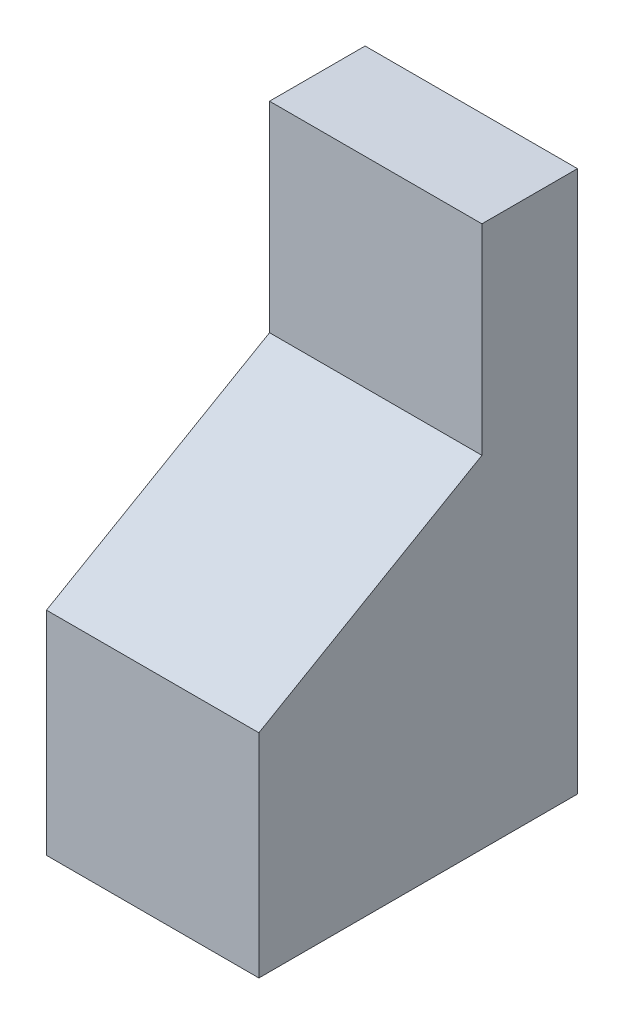
ISO-10303-21;
HEADER;
FILE_DESCRIPTION(('STEP AP214'),'2;1');
FILE_NAME('part.step','',(''),(''),'','','');
FILE_SCHEMA(('AUTOMOTIVE_DESIGN { 1 0 10303 214 1 1 1 1 }'));
ENDSEC;
DATA;
#1=APPLICATION_CONTEXT('core data for automotive mechanical design processes');
#2=APPLICATION_PROTOCOL_DEFINITION('international standard','automotive_design',2000,#1);
#3=PRODUCT_CONTEXT('',#1,'mechanical');
#4=PRODUCT('Part','Part','',(#3));
#5=PRODUCT_RELATED_PRODUCT_CATEGORY('part','',(#4));
#6=PRODUCT_DEFINITION_FORMATION('','',#4);
#7=PRODUCT_DEFINITION_CONTEXT('part definition',#1,'design');
#8=PRODUCT_DEFINITION('design','',#6,#7);
#9=PRODUCT_DEFINITION_SHAPE('','',#8);
#10=(LENGTH_UNIT() NAMED_UNIT(*) SI_UNIT(.MILLI.,.METRE.));
#11=(NAMED_UNIT(*) PLANE_ANGLE_UNIT() SI_UNIT($,.RADIAN.));
#12=(NAMED_UNIT(*) SI_UNIT($,.STERADIAN.) SOLID_ANGLE_UNIT());
#13=UNCERTAINTY_MEASURE_WITH_UNIT(LENGTH_MEASURE(1.E-05),#10,'distance_accuracy_value','');
#14=(GEOMETRIC_REPRESENTATION_CONTEXT(3) GLOBAL_UNCERTAINTY_ASSIGNED_CONTEXT((#13)) GLOBAL_UNIT_ASSIGNED_CONTEXT((#10,
#11,#12)) REPRESENTATION_CONTEXT('',''));
#15=CARTESIAN_POINT('',(0.,0.,0.));
#16=DIRECTION('',(0.,0.,1.));
#17=DIRECTION('',(1.,0.,0.));
#18=AXIS2_PLACEMENT_3D('',#15,#16,#17);
#19=CARTESIAN_POINT('',(2.,-7.60000000071907,-5.49999999900638));
#20=DIRECTION('',(-1.,0.,0.));
#21=DIRECTION('',(0.,0.,1.));
#22=AXIS2_PLACEMENT_3D('',#19,#20,#21);
#23=PLANE('',#22);
#24=DIRECTION('',(0.,-1.,1.30739807868707E-10));
#25=VECTOR('',#24,1.);
#26=CARTESIAN_POINT('',(2.,-5.60029761185844,-5.49999999926782));
#27=LINE('',#26,#25);
#28=CARTESIAN_POINT('',(2.,-5.60029761185844,-5.49999999926782));
#29=VERTEX_POINT('',#28);
#30=CARTESIAN_POINT('',(2.,-7.60000000071907,-5.49999999900638));
#31=VERTEX_POINT('',#30);
#32=EDGE_CURVE('E11',#29,#31,#27,.T.);
#33=ORIENTED_EDGE('',*,*,#32,.T.);
#34=DIRECTION('',(0.,-1.30739807868707E-10,-1.));
#35=VECTOR('',#34,1.);
#36=CARTESIAN_POINT('',(2.,-7.60000000071907,-5.49999999900638));
#37=LINE('',#36,#35);
#38=CARTESIAN_POINT('',(2.,-7.60000000111129,-8.49999999900638));
#39=VERTEX_POINT('',#38);
#40=EDGE_CURVE('E24',#31,#39,#37,.T.);
#41=ORIENTED_EDGE('',*,*,#40,.T.);
#42=DIRECTION('',(0.,1.,-1.30739807868707E-10));
#43=VECTOR('',#42,1.);
#44=CARTESIAN_POINT('',(2.,-7.60000000111129,-8.49999999900638));
#45=LINE('',#44,#43);
#46=CARTESIAN_POINT('',(2.,-2.50000000111129,-8.49999999967315));
#47=VERTEX_POINT('',#46);
#48=EDGE_CURVE('E82',#39,#47,#45,.T.);
#49=ORIENTED_EDGE('',*,*,#48,.T.);
#50=DIRECTION('',(0.,1.30735952927649E-10,1.));
#51=VECTOR('',#50,1.);
#52=CARTESIAN_POINT('',(2.,-2.50000000111129,-8.49999999967315));
#53=LINE('',#52,#51);
#54=CARTESIAN_POINT('',(2.,-2.50000000099363,-7.59999999967315));
#55=VERTEX_POINT('',#54);
#56=EDGE_CURVE('E113',#47,#55,#53,.T.);
#57=ORIENTED_EDGE('',*,*,#56,.T.);
#58=DIRECTION('',(0.,-1.,1.30740267309978E-10));
#59=VECTOR('',#58,1.);
#60=CARTESIAN_POINT('',(2.,-2.50000000099363,-7.59999999967315));
#61=LINE('',#60,#59);
#62=CARTESIAN_POINT('',(2.,-4.38786204683478,-7.59999999942633));
#63=VERTEX_POINT('',#62);
#64=EDGE_CURVE('E111',#55,#63,#61,.T.);
#65=ORIENTED_EDGE('',*,*,#64,.T.);
#66=DIRECTION('',(0.,-0.499999999886776,0.866025403849808));
#67=VECTOR('',#66,1.);
#68=CARTESIAN_POINT('',(2.,-4.38786204683478,-7.59999999942633));
#69=LINE('',#68,#67);
#70=EDGE_CURVE('E109',#63,#29,#69,.T.);
#71=ORIENTED_EDGE('',*,*,#70,.T.);
#72=EDGE_LOOP('',(#33,#41,#49,#57,#65,#71));
#73=FACE_BOUND('',#72,.T.);
#74=ADVANCED_FACE('F17',(#73),#23,.F.);
#75=CARTESIAN_POINT('',(2.,-4.38786204683478,-7.59999999942633));
#76=DIRECTION('',(0.,0.866025403849808,0.499999999886776));
#77=DIRECTION('',(1.,0.,0.));
#78=AXIS2_PLACEMENT_3D('',#75,#76,#77);
#79=PLANE('',#78);
#80=DIRECTION('',(0.,-0.499999999886776,0.866025403849808));
#81=VECTOR('',#80,1.);
#82=CARTESIAN_POINT('',(0.,-4.38786204683478,-7.59999999942633));
#83=LINE('',#82,#81);
#84=CARTESIAN_POINT('',(0.,-4.38786204683478,-7.59999999942633));
#85=VERTEX_POINT('',#84);
#86=CARTESIAN_POINT('',(0.,-5.60029761185844,-5.49999999926782));
#87=VERTEX_POINT('',#86);
#88=EDGE_CURVE('E107',#85,#87,#83,.T.);
#89=ORIENTED_EDGE('',*,*,#88,.T.);
#90=DIRECTION('',(-1.,0.,0.));
#91=VECTOR('',#90,1.);
#92=CARTESIAN_POINT('',(2.,-5.60029761185844,-5.49999999926782));
#93=LINE('',#92,#91);
#94=EDGE_CURVE('E105',#29,#87,#93,.T.);
#95=ORIENTED_EDGE('',*,*,#94,.F.);
#96=ORIENTED_EDGE('',*,*,#70,.F.);
#97=DIRECTION('',(-1.,0.,0.));
#98=VECTOR('',#97,1.);
#99=CARTESIAN_POINT('',(2.,-4.38786204683478,-7.59999999942633));
#100=LINE('',#99,#98);
#101=EDGE_CURVE('E102',#63,#85,#100,.T.);
#102=ORIENTED_EDGE('',*,*,#101,.T.);
#103=EDGE_LOOP('',(#89,#95,#96,#102));
#104=FACE_BOUND('',#103,.T.);
#105=ADVANCED_FACE('F121',(#104),#79,.T.);
#106=CARTESIAN_POINT('',(2.,-2.50000000099363,-7.59999999967315));
#107=DIRECTION('',(0.,1.30740267309978E-10,1.));
#108=DIRECTION('',(1.,0.,0.));
#109=AXIS2_PLACEMENT_3D('',#106,#107,#108);
#110=PLANE('',#109);
#111=DIRECTION('',(0.,-1.,1.30740267309978E-10));
#112=VECTOR('',#111,1.);
#113=CARTESIAN_POINT('',(0.,-2.50000000099363,-7.59999999967315));
#114=LINE('',#113,#112);
#115=CARTESIAN_POINT('',(0.,-2.50000000099363,-7.59999999967315));
#116=VERTEX_POINT('',#115);
#117=EDGE_CURVE('E99',#116,#85,#114,.T.);
#118=ORIENTED_EDGE('',*,*,#117,.T.);
#119=ORIENTED_EDGE('',*,*,#101,.F.);
#120=ORIENTED_EDGE('',*,*,#64,.F.);
#121=DIRECTION('',(-1.,0.,0.));
#122=VECTOR('',#121,1.);
#123=CARTESIAN_POINT('',(2.,-2.50000000099363,-7.59999999967315));
#124=LINE('',#123,#122);
#125=EDGE_CURVE('E96',#55,#116,#124,.T.);
#126=ORIENTED_EDGE('',*,*,#125,.T.);
#127=EDGE_LOOP('',(#118,#119,#120,#126));
#128=FACE_BOUND('',#127,.T.);
#129=ADVANCED_FACE('F124',(#128),#110,.T.);
#130=CARTESIAN_POINT('',(2.,-2.50000000111129,-8.49999999967315));
#131=DIRECTION('',(0.,1.,-1.30735952927649E-10));
#132=DIRECTION('',(-1.,0.,0.));
#133=AXIS2_PLACEMENT_3D('',#130,#131,#132);
#134=PLANE('',#133);
#135=DIRECTION('',(-1.,0.,0.));
#136=VECTOR('',#135,1.);
#137=CARTESIAN_POINT('',(2.,-2.50000000111129,-8.49999999967315));
#138=LINE('',#137,#136);
#139=CARTESIAN_POINT('',(0.,-2.50000000111129,-8.49999999967315));
#140=VERTEX_POINT('',#139);
#141=EDGE_CURVE('E94',#47,#140,#138,.T.);
#142=ORIENTED_EDGE('',*,*,#141,.T.);
#143=DIRECTION('',(0.,1.30735952927649E-10,1.));
#144=VECTOR('',#143,1.);
#145=CARTESIAN_POINT('',(0.,-2.50000000111129,-8.49999999967315));
#146=LINE('',#145,#144);
#147=EDGE_CURVE('E87',#140,#116,#146,.T.);
#148=ORIENTED_EDGE('',*,*,#147,.T.);
#149=ORIENTED_EDGE('',*,*,#125,.F.);
#150=ORIENTED_EDGE('',*,*,#56,.F.);
#151=EDGE_LOOP('',(#142,#148,#149,#150));
#152=FACE_BOUND('',#151,.T.);
#153=ADVANCED_FACE('F127',(#152),#134,.T.);
#154=CARTESIAN_POINT('',(2.,-5.60029761185844,-5.49999999926782));
#155=DIRECTION('',(0.,1.30739807868707E-10,1.));
#156=DIRECTION('',(1.,0.,0.));
#157=AXIS2_PLACEMENT_3D('',#154,#155,#156);
#158=PLANE('',#157);
#159=DIRECTION('',(0.,-1.,1.30739807868707E-10));
#160=VECTOR('',#159,1.);
#161=CARTESIAN_POINT('',(0.,-5.60029761185844,-5.49999999926782));
#162=LINE('',#161,#160);
#163=CARTESIAN_POINT('',(0.,-7.60000000071908,-5.49999999900638));
#164=VERTEX_POINT('',#163);
#165=EDGE_CURVE('E91',#87,#164,#162,.T.);
#166=ORIENTED_EDGE('',*,*,#165,.T.);
#167=DIRECTION('',(-1.,0.,0.));
#168=VECTOR('',#167,1.);
#169=CARTESIAN_POINT('',(2.,-7.60000000071907,-5.49999999900638));
#170=LINE('',#169,#168);
#171=EDGE_CURVE('E71',#31,#164,#170,.T.);
#172=ORIENTED_EDGE('',*,*,#171,.F.);
#173=ORIENTED_EDGE('',*,*,#32,.F.);
#174=ORIENTED_EDGE('',*,*,#94,.T.);
#175=EDGE_LOOP('',(#166,#172,#173,#174));
#176=FACE_BOUND('',#175,.T.);
#177=ADVANCED_FACE('F116',(#176),#158,.T.);
#178=CARTESIAN_POINT('',(-8.,-7.60000000049682,-3.79999999900637));
#179=DIRECTION('',(0.,1.,-1.30739807868707E-10));
#180=DIRECTION('',(-1.,0.,0.));
#181=AXIS2_PLACEMENT_3D('',#178,#179,#180);
#182=PLANE('',#181);
#183=DIRECTION('',(0.,1.30739807868707E-10,1.));
#184=VECTOR('',#183,1.);
#185=CARTESIAN_POINT('',(0.,-7.60000000049682,-3.79999999900637));
#186=LINE('',#185,#184);
#187=CARTESIAN_POINT('',(0.,-7.60000000111128,-8.49999999900638));
#188=VERTEX_POINT('',#187);
#189=EDGE_CURVE('E67',#188,#164,#186,.T.);
#190=ORIENTED_EDGE('',*,*,#189,.F.);
#191=DIRECTION('',(1.,0.,0.));
#192=VECTOR('',#191,1.);
#193=CARTESIAN_POINT('',(-8.,-7.6000000011113,-8.49999999900638));
#194=LINE('',#193,#192);
#195=EDGE_CURVE('E70',#188,#39,#194,.T.);
#196=ORIENTED_EDGE('',*,*,#195,.T.);
#197=ORIENTED_EDGE('',*,*,#40,.F.);
#198=ORIENTED_EDGE('',*,*,#171,.T.);
#199=EDGE_LOOP('',(#190,#196,#197,#198));
#200=FACE_BOUND('',#199,.T.);
#201=ADVANCED_FACE('F69',(#200),#182,.F.);
#202=CARTESIAN_POINT('',(-8.,9.74999999888873,-8.50000000127471));
#203=DIRECTION('',(0.,1.30739807868707E-10,1.));
#204=DIRECTION('',(1.,0.,0.));
#205=AXIS2_PLACEMENT_3D('',#202,#203,#204);
#206=PLANE('',#205);
#207=DIRECTION('',(0.,-1.,1.30739807868707E-10));
#208=VECTOR('',#207,1.);
#209=CARTESIAN_POINT('',(0.,9.74999999888873,-8.50000000127471));
#210=LINE('',#209,#208);
#211=EDGE_CURVE('E81',#140,#188,#210,.T.);
#212=ORIENTED_EDGE('',*,*,#211,.F.);
#213=ORIENTED_EDGE('',*,*,#141,.F.);
#214=ORIENTED_EDGE('',*,*,#48,.F.);
#215=ORIENTED_EDGE('',*,*,#195,.F.);
#216=EDGE_LOOP('',(#212,#213,#214,#215));
#217=FACE_BOUND('',#216,.T.);
#218=ADVANCED_FACE('F79',(#217),#206,.F.);
#219=CARTESIAN_POINT('',(0.,0.,0.));
#220=DIRECTION('',(-1.,0.,0.));
#221=DIRECTION('',(0.,0.,1.));
#222=AXIS2_PLACEMENT_3D('',#219,#220,#221);
#223=PLANE('',#222);
#224=ORIENTED_EDGE('',*,*,#147,.F.);
#225=ORIENTED_EDGE('',*,*,#211,.T.);
#226=ORIENTED_EDGE('',*,*,#189,.T.);
#227=ORIENTED_EDGE('',*,*,#165,.F.);
#228=ORIENTED_EDGE('',*,*,#88,.F.);
#229=ORIENTED_EDGE('',*,*,#117,.F.);
#230=EDGE_LOOP('',(#224,#225,#226,#227,#228,#229));
#231=FACE_BOUND('',#230,.T.);
#232=ADVANCED_FACE('F85',(#231),#223,.T.);
#233=CLOSED_SHELL('',(#74,#105,#129,#153,#177,#201,#218,#232));
#234=MANIFOLD_SOLID_BREP('B1',#233);
#235=ADVANCED_BREP_SHAPE_REPRESENTATION('',(#18,#234),#14);
#236=SHAPE_DEFINITION_REPRESENTATION(#9,#235);
ENDSEC;
END-ISO-10303-21;
